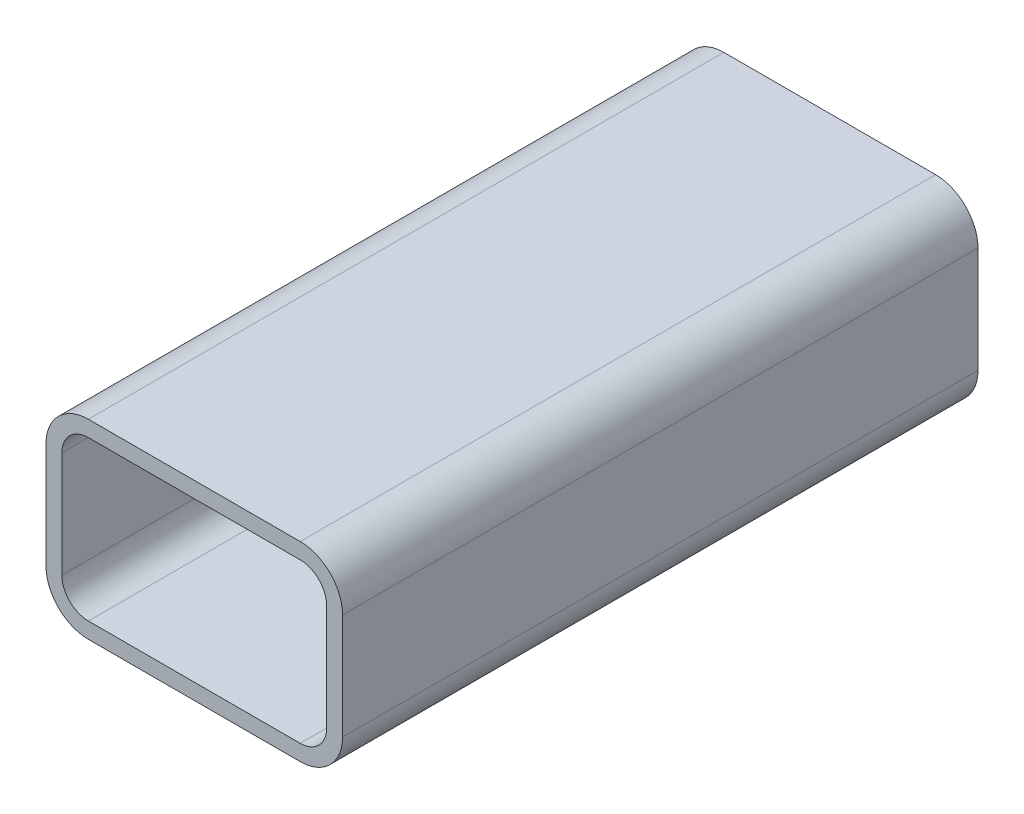
ISO-10303-21;
HEADER;
FILE_DESCRIPTION(('STEP AP214'),'2;1');
FILE_NAME('part.step','',(''),(''),'','','');
FILE_SCHEMA(('AUTOMOTIVE_DESIGN { 1 0 10303 214 1 1 1 1 }'));
ENDSEC;
DATA;
#1=APPLICATION_CONTEXT('core data for automotive mechanical design processes');
#2=APPLICATION_PROTOCOL_DEFINITION('international standard','automotive_design',2000,#1);
#3=PRODUCT_CONTEXT('',#1,'mechanical');
#4=PRODUCT('Part','Part','',(#3));
#5=PRODUCT_RELATED_PRODUCT_CATEGORY('part','',(#4));
#6=PRODUCT_DEFINITION_FORMATION('','',#4);
#7=PRODUCT_DEFINITION_CONTEXT('part definition',#1,'design');
#8=PRODUCT_DEFINITION('design','',#6,#7);
#9=PRODUCT_DEFINITION_SHAPE('','',#8);
#10=(LENGTH_UNIT() NAMED_UNIT(*) SI_UNIT(.MILLI.,.METRE.));
#11=(NAMED_UNIT(*) PLANE_ANGLE_UNIT() SI_UNIT($,.RADIAN.));
#12=(NAMED_UNIT(*) SI_UNIT($,.STERADIAN.) SOLID_ANGLE_UNIT());
#13=UNCERTAINTY_MEASURE_WITH_UNIT(LENGTH_MEASURE(1.E-05),#10,'distance_accuracy_value','');
#14=(GEOMETRIC_REPRESENTATION_CONTEXT(3) GLOBAL_UNCERTAINTY_ASSIGNED_CONTEXT((#13)) GLOBAL_UNIT_ASSIGNED_CONTEXT((#10,
#11,#12)) REPRESENTATION_CONTEXT('',''));
#15=CARTESIAN_POINT('',(0.,0.,0.));
#16=DIRECTION('',(0.,0.,1.));
#17=DIRECTION('',(1.,0.,0.));
#18=AXIS2_PLACEMENT_3D('',#15,#16,#17);
#19=CARTESIAN_POINT('',(-20.,10.,60.));
#20=DIRECTION('',(0.,0.,1.));
#21=DIRECTION('',(1.,0.,0.));
#22=AXIS2_PLACEMENT_3D('',#19,#20,#21);
#23=PLANE('',#22);
#24=CARTESIAN_POINT('',(-20.,10.,60.));
#25=DIRECTION('',(0.,0.,1.));
#26=DIRECTION('',(1.,0.,0.));
#27=AXIS2_PLACEMENT_3D('',#24,#25,#26);
#28=CIRCLE('',#27,8.);
#29=CARTESIAN_POINT('',(-19.9999999999999,18.,60.));
#30=VERTEX_POINT('',#29);
#31=CARTESIAN_POINT('',(-28.,9.99999999999996,60.));
#32=VERTEX_POINT('',#31);
#33=EDGE_CURVE('E264',#30,#32,#28,.T.);
#34=ORIENTED_EDGE('',*,*,#33,.T.);
#35=DIRECTION('',(0.,-1.,0.));
#36=VECTOR('',#35,1.);
#37=CARTESIAN_POINT('',(-28.,9.99999999999996,60.));
#38=LINE('',#37,#36);
#39=CARTESIAN_POINT('',(-28.,-9.99999999999996,60.));
#40=VERTEX_POINT('',#39);
#41=EDGE_CURVE('E267',#32,#40,#38,.T.);
#42=ORIENTED_EDGE('',*,*,#41,.T.);
#43=CARTESIAN_POINT('',(-20.,-10.,60.));
#44=DIRECTION('',(0.,0.,1.));
#45=DIRECTION('',(1.,0.,0.));
#46=AXIS2_PLACEMENT_3D('',#43,#44,#45);
#47=CIRCLE('',#46,8.);
#48=CARTESIAN_POINT('',(-19.9999999999999,-18.,60.));
#49=VERTEX_POINT('',#48);
#50=EDGE_CURVE('E270',#40,#49,#47,.T.);
#51=ORIENTED_EDGE('',*,*,#50,.T.);
#52=DIRECTION('',(1.,0.,0.));
#53=VECTOR('',#52,1.);
#54=CARTESIAN_POINT('',(-20.,-18.,60.));
#55=LINE('',#54,#53);
#56=CARTESIAN_POINT('',(20.,-18.,60.));
#57=VERTEX_POINT('',#56);
#58=EDGE_CURVE('E272',#49,#57,#55,.T.);
#59=ORIENTED_EDGE('',*,*,#58,.T.);
#60=CARTESIAN_POINT('',(20.,-10.,60.));
#61=DIRECTION('',(0.,0.,1.));
#62=DIRECTION('',(1.,0.,0.));
#63=AXIS2_PLACEMENT_3D('',#60,#61,#62);
#64=CIRCLE('',#63,8.);
#65=CARTESIAN_POINT('',(28.,-9.99999999999996,60.));
#66=VERTEX_POINT('',#65);
#67=EDGE_CURVE('E274',#57,#66,#64,.T.);
#68=ORIENTED_EDGE('',*,*,#67,.T.);
#69=DIRECTION('',(0.,-1.,0.));
#70=VECTOR('',#69,1.);
#71=CARTESIAN_POINT('',(28.,9.99999999999997,60.));
#72=LINE('',#71,#70);
#73=CARTESIAN_POINT('',(28.,9.99999999999995,60.));
#74=VERTEX_POINT('',#73);
#75=EDGE_CURVE('E276',#74,#66,#72,.T.);
#76=ORIENTED_EDGE('',*,*,#75,.F.);
#77=CARTESIAN_POINT('',(20.,10.,60.));
#78=DIRECTION('',(0.,0.,1.));
#79=DIRECTION('',(1.,0.,0.));
#80=AXIS2_PLACEMENT_3D('',#77,#78,#79);
#81=CIRCLE('',#80,8.);
#82=CARTESIAN_POINT('',(20.,18.,60.));
#83=VERTEX_POINT('',#82);
#84=EDGE_CURVE('E279',#83,#74,#81,.F.);
#85=ORIENTED_EDGE('',*,*,#84,.F.);
#86=DIRECTION('',(1.,0.,0.));
#87=VECTOR('',#86,1.);
#88=CARTESIAN_POINT('',(-20.,18.,60.));
#89=LINE('',#88,#87);
#90=EDGE_CURVE('E282',#30,#83,#89,.T.);
#91=ORIENTED_EDGE('',*,*,#90,.F.);
#92=EDGE_LOOP('',(#34,#42,#51,#59,#68,#76,#85,#91));
#93=FACE_BOUND('',#92,.T.);
#94=DIRECTION('',(0.,-1.,0.));
#95=VECTOR('',#94,1.);
#96=CARTESIAN_POINT('',(-25.,9.99999999999996,60.));
#97=LINE('',#96,#95);
#98=CARTESIAN_POINT('',(-25.,9.99999999999996,60.));
#99=VERTEX_POINT('',#98);
#100=CARTESIAN_POINT('',(-25.,-9.99999999999996,60.));
#101=VERTEX_POINT('',#100);
#102=EDGE_CURVE('E206',#99,#101,#97,.T.);
#103=ORIENTED_EDGE('',*,*,#102,.F.);
#104=CARTESIAN_POINT('',(-20.,10.,60.));
#105=DIRECTION('',(0.,0.,1.));
#106=DIRECTION('',(1.,0.,0.));
#107=AXIS2_PLACEMENT_3D('',#104,#105,#106);
#108=CIRCLE('',#107,5.);
#109=CARTESIAN_POINT('',(-20.,15.,60.));
#110=VERTEX_POINT('',#109);
#111=EDGE_CURVE('E197',#110,#99,#108,.T.);
#112=ORIENTED_EDGE('',*,*,#111,.F.);
#113=DIRECTION('',(1.,0.,0.));
#114=VECTOR('',#113,1.);
#115=CARTESIAN_POINT('',(-20.,15.,60.));
#116=LINE('',#115,#114);
#117=CARTESIAN_POINT('',(20.,15.,60.));
#118=VERTEX_POINT('',#117);
#119=EDGE_CURVE('E231',#110,#118,#116,.T.);
#120=ORIENTED_EDGE('',*,*,#119,.T.);
#121=CARTESIAN_POINT('',(20.,10.,60.));
#122=DIRECTION('',(0.,0.,-1.));
#123=DIRECTION('',(-1.,0.,0.));
#124=AXIS2_PLACEMENT_3D('',#121,#122,#123);
#125=CIRCLE('',#124,5.);
#126=CARTESIAN_POINT('',(25.,9.99999999999997,60.));
#127=VERTEX_POINT('',#126);
#128=EDGE_CURVE('E100',#118,#127,#125,.T.);
#129=ORIENTED_EDGE('',*,*,#128,.T.);
#130=DIRECTION('',(0.,-1.,0.));
#131=VECTOR('',#130,1.);
#132=CARTESIAN_POINT('',(25.,9.99999999999997,60.));
#133=LINE('',#132,#131);
#134=CARTESIAN_POINT('',(25.,-9.99999999999996,60.));
#135=VERTEX_POINT('',#134);
#136=EDGE_CURVE('E227',#127,#135,#133,.T.);
#137=ORIENTED_EDGE('',*,*,#136,.T.);
#138=CARTESIAN_POINT('',(20.,-10.,60.));
#139=DIRECTION('',(0.,0.,1.));
#140=DIRECTION('',(1.,0.,0.));
#141=AXIS2_PLACEMENT_3D('',#138,#139,#140);
#142=CIRCLE('',#141,5.);
#143=CARTESIAN_POINT('',(20.,-15.,60.));
#144=VERTEX_POINT('',#143);
#145=EDGE_CURVE('E225',#144,#135,#142,.T.);
#146=ORIENTED_EDGE('',*,*,#145,.F.);
#147=DIRECTION('',(1.,0.,0.));
#148=VECTOR('',#147,1.);
#149=CARTESIAN_POINT('',(-20.,-15.,60.));
#150=LINE('',#149,#148);
#151=CARTESIAN_POINT('',(-20.,-15.,60.));
#152=VERTEX_POINT('',#151);
#153=EDGE_CURVE('E221',#152,#144,#150,.T.);
#154=ORIENTED_EDGE('',*,*,#153,.F.);
#155=CARTESIAN_POINT('',(-20.,-10.,60.));
#156=DIRECTION('',(0.,0.,1.));
#157=DIRECTION('',(1.,0.,0.));
#158=AXIS2_PLACEMENT_3D('',#155,#156,#157);
#159=CIRCLE('',#158,5.);
#160=EDGE_CURVE('E219',#101,#152,#159,.T.);
#161=ORIENTED_EDGE('',*,*,#160,.F.);
#162=EDGE_LOOP('',(#103,#112,#120,#129,#137,#146,#154,#161));
#163=FACE_BOUND('',#162,.T.);
#164=ADVANCED_FACE('F85',(#93,#163),#23,.T.);
#165=CARTESIAN_POINT('',(-20.,10.,-60.));
#166=DIRECTION('',(0.,0.,1.));
#167=DIRECTION('',(1.,0.,0.));
#168=AXIS2_PLACEMENT_3D('',#165,#166,#167);
#169=PLANE('',#168);
#170=CARTESIAN_POINT('',(-20.,10.,-60.));
#171=DIRECTION('',(0.,0.,1.));
#172=DIRECTION('',(1.,0.,0.));
#173=AXIS2_PLACEMENT_3D('',#170,#171,#172);
#174=CIRCLE('',#173,8.);
#175=CARTESIAN_POINT('',(-19.9999999999999,18.,-60.));
#176=VERTEX_POINT('',#175);
#177=CARTESIAN_POINT('',(-28.,9.99999999999996,-60.));
#178=VERTEX_POINT('',#177);
#179=EDGE_CURVE('E214',#176,#178,#174,.T.);
#180=ORIENTED_EDGE('',*,*,#179,.F.);
#181=DIRECTION('',(1.,0.,0.));
#182=VECTOR('',#181,1.);
#183=CARTESIAN_POINT('',(-20.,18.,-60.));
#184=LINE('',#183,#182);
#185=CARTESIAN_POINT('',(20.,18.,-60.));
#186=VERTEX_POINT('',#185);
#187=EDGE_CURVE('E268',#176,#186,#184,.T.);
#188=ORIENTED_EDGE('',*,*,#187,.T.);
#189=CARTESIAN_POINT('',(20.,10.,-60.));
#190=DIRECTION('',(0.,0.,1.));
#191=DIRECTION('',(1.,0.,0.));
#192=AXIS2_PLACEMENT_3D('',#189,#190,#191);
#193=CIRCLE('',#192,8.);
#194=CARTESIAN_POINT('',(28.,9.99999999999995,-60.));
#195=VERTEX_POINT('',#194);
#196=EDGE_CURVE('E300',#186,#195,#193,.F.);
#197=ORIENTED_EDGE('',*,*,#196,.T.);
#198=DIRECTION('',(0.,-1.,0.));
#199=VECTOR('',#198,1.);
#200=CARTESIAN_POINT('',(28.,9.99999999999997,-60.));
#201=LINE('',#200,#199);
#202=CARTESIAN_POINT('',(28.,-9.99999999999996,-60.));
#203=VERTEX_POINT('',#202);
#204=EDGE_CURVE('E297',#195,#203,#201,.T.);
#205=ORIENTED_EDGE('',*,*,#204,.T.);
#206=CARTESIAN_POINT('',(20.,-10.,-60.));
#207=DIRECTION('',(0.,0.,1.));
#208=DIRECTION('',(1.,0.,0.));
#209=AXIS2_PLACEMENT_3D('',#206,#207,#208);
#210=CIRCLE('',#209,8.);
#211=CARTESIAN_POINT('',(20.,-18.,-60.));
#212=VERTEX_POINT('',#211);
#213=EDGE_CURVE('E294',#212,#203,#210,.T.);
#214=ORIENTED_EDGE('',*,*,#213,.F.);
#215=DIRECTION('',(1.,0.,0.));
#216=VECTOR('',#215,1.);
#217=CARTESIAN_POINT('',(-20.,-18.,-60.));
#218=LINE('',#217,#216);
#219=CARTESIAN_POINT('',(-19.9999999999999,-18.,-60.));
#220=VERTEX_POINT('',#219);
#221=EDGE_CURVE('E292',#220,#212,#218,.T.);
#222=ORIENTED_EDGE('',*,*,#221,.F.);
#223=CARTESIAN_POINT('',(-20.,-10.,-60.));
#224=DIRECTION('',(0.,0.,1.));
#225=DIRECTION('',(1.,0.,0.));
#226=AXIS2_PLACEMENT_3D('',#223,#224,#225);
#227=CIRCLE('',#226,8.);
#228=CARTESIAN_POINT('',(-28.,-9.99999999999996,-60.));
#229=VERTEX_POINT('',#228);
#230=EDGE_CURVE('E290',#229,#220,#227,.T.);
#231=ORIENTED_EDGE('',*,*,#230,.F.);
#232=DIRECTION('',(0.,-1.,0.));
#233=VECTOR('',#232,1.);
#234=CARTESIAN_POINT('',(-28.,9.99999999999996,-60.));
#235=LINE('',#234,#233);
#236=EDGE_CURVE('E288',#178,#229,#235,.T.);
#237=ORIENTED_EDGE('',*,*,#236,.F.);
#238=EDGE_LOOP('',(#180,#188,#197,#205,#214,#222,#231,#237));
#239=FACE_BOUND('',#238,.T.);
#240=CARTESIAN_POINT('',(-20.,10.,-60.));
#241=DIRECTION('',(0.,0.,1.));
#242=DIRECTION('',(1.,0.,0.));
#243=AXIS2_PLACEMENT_3D('',#240,#241,#242);
#244=CIRCLE('',#243,5.);
#245=CARTESIAN_POINT('',(-20.,15.,-60.));
#246=VERTEX_POINT('',#245);
#247=CARTESIAN_POINT('',(-25.,9.99999999999996,-60.));
#248=VERTEX_POINT('',#247);
#249=EDGE_CURVE('E108',#246,#248,#244,.T.);
#250=ORIENTED_EDGE('',*,*,#249,.T.);
#251=DIRECTION('',(0.,-1.,0.));
#252=VECTOR('',#251,1.);
#253=CARTESIAN_POINT('',(-25.,9.99999999999996,-60.));
#254=LINE('',#253,#252);
#255=CARTESIAN_POINT('',(-25.,-9.99999999999996,-60.));
#256=VERTEX_POINT('',#255);
#257=EDGE_CURVE('E213',#248,#256,#254,.T.);
#258=ORIENTED_EDGE('',*,*,#257,.T.);
#259=CARTESIAN_POINT('',(-20.,-10.,-60.));
#260=DIRECTION('',(0.,0.,1.));
#261=DIRECTION('',(1.,0.,0.));
#262=AXIS2_PLACEMENT_3D('',#259,#260,#261);
#263=CIRCLE('',#262,5.);
#264=CARTESIAN_POINT('',(-20.,-15.,-60.));
#265=VERTEX_POINT('',#264);
#266=EDGE_CURVE('E235',#256,#265,#263,.T.);
#267=ORIENTED_EDGE('',*,*,#266,.T.);
#268=DIRECTION('',(1.,0.,0.));
#269=VECTOR('',#268,1.);
#270=CARTESIAN_POINT('',(-20.,-15.,-60.));
#271=LINE('',#270,#269);
#272=CARTESIAN_POINT('',(20.,-15.,-60.));
#273=VERTEX_POINT('',#272);
#274=EDGE_CURVE('E238',#265,#273,#271,.T.);
#275=ORIENTED_EDGE('',*,*,#274,.T.);
#276=CARTESIAN_POINT('',(20.,-10.,-60.));
#277=DIRECTION('',(0.,0.,1.));
#278=DIRECTION('',(1.,0.,0.));
#279=AXIS2_PLACEMENT_3D('',#276,#277,#278);
#280=CIRCLE('',#279,5.);
#281=CARTESIAN_POINT('',(25.,-9.99999999999996,-60.));
#282=VERTEX_POINT('',#281);
#283=EDGE_CURVE('E241',#273,#282,#280,.T.);
#284=ORIENTED_EDGE('',*,*,#283,.T.);
#285=DIRECTION('',(0.,-1.,0.));
#286=VECTOR('',#285,1.);
#287=CARTESIAN_POINT('',(25.,9.99999999999997,-60.));
#288=LINE('',#287,#286);
#289=CARTESIAN_POINT('',(25.,9.99999999999997,-60.));
#290=VERTEX_POINT('',#289);
#291=EDGE_CURVE('E244',#290,#282,#288,.T.);
#292=ORIENTED_EDGE('',*,*,#291,.F.);
#293=CARTESIAN_POINT('',(20.,10.,-60.));
#294=DIRECTION('',(0.,0.,-1.));
#295=DIRECTION('',(-1.,0.,0.));
#296=AXIS2_PLACEMENT_3D('',#293,#294,#295);
#297=CIRCLE('',#296,5.);
#298=CARTESIAN_POINT('',(20.,15.,-60.));
#299=VERTEX_POINT('',#298);
#300=EDGE_CURVE('E247',#299,#290,#297,.T.);
#301=ORIENTED_EDGE('',*,*,#300,.F.);
#302=DIRECTION('',(1.,0.,0.));
#303=VECTOR('',#302,1.);
#304=CARTESIAN_POINT('',(-20.,15.,-60.));
#305=LINE('',#304,#303);
#306=EDGE_CURVE('E207',#246,#299,#305,.T.);
#307=ORIENTED_EDGE('',*,*,#306,.F.);
#308=EDGE_LOOP('',(#250,#258,#267,#275,#284,#292,#301,#307));
#309=FACE_BOUND('',#308,.T.);
#310=ADVANCED_FACE('F328',(#239,#309),#169,.F.);
#311=CARTESIAN_POINT('',(-20.,10.,60.));
#312=DIRECTION('',(0.,0.,-1.));
#313=DIRECTION('',(-1.,0.,0.));
#314=AXIS2_PLACEMENT_3D('',#311,#312,#313);
#315=CYLINDRICAL_SURFACE('',#314,8.);
#316=ORIENTED_EDGE('',*,*,#179,.T.);
#317=DIRECTION('',(0.,0.,-1.));
#318=VECTOR('',#317,1.);
#319=CARTESIAN_POINT('',(-28.,9.99999999999996,60.));
#320=LINE('',#319,#318);
#321=EDGE_CURVE('E12',#32,#178,#320,.T.);
#322=ORIENTED_EDGE('',*,*,#321,.F.);
#323=ORIENTED_EDGE('',*,*,#33,.F.);
#324=DIRECTION('',(0.,0.,-1.));
#325=VECTOR('',#324,1.);
#326=CARTESIAN_POINT('',(-19.9999999999999,18.,60.));
#327=LINE('',#326,#325);
#328=EDGE_CURVE('E285',#30,#176,#327,.T.);
#329=ORIENTED_EDGE('',*,*,#328,.T.);
#330=EDGE_LOOP('',(#316,#322,#323,#329));
#331=FACE_BOUND('',#330,.T.);
#332=ADVANCED_FACE('F87',(#331),#315,.T.);
#333=CARTESIAN_POINT('',(-28.,9.99999999999996,60.));
#334=DIRECTION('',(1.,0.,0.));
#335=DIRECTION('',(0.,1.,0.));
#336=AXIS2_PLACEMENT_3D('',#333,#334,#335);
#337=PLANE('',#336);
#338=ORIENTED_EDGE('',*,*,#236,.T.);
#339=DIRECTION('',(0.,0.,-1.));
#340=VECTOR('',#339,1.);
#341=CARTESIAN_POINT('',(-28.,-9.99999999999996,60.));
#342=LINE('',#341,#340);
#343=EDGE_CURVE('E93',#40,#229,#342,.T.);
#344=ORIENTED_EDGE('',*,*,#343,.F.);
#345=ORIENTED_EDGE('',*,*,#41,.F.);
#346=ORIENTED_EDGE('',*,*,#321,.T.);
#347=EDGE_LOOP('',(#338,#344,#345,#346));
#348=FACE_BOUND('',#347,.T.);
#349=ADVANCED_FACE('F345',(#348),#337,.F.);
#350=CARTESIAN_POINT('',(-20.,-10.,60.));
#351=DIRECTION('',(0.,0.,-1.));
#352=DIRECTION('',(-1.,0.,0.));
#353=AXIS2_PLACEMENT_3D('',#350,#351,#352);
#354=CYLINDRICAL_SURFACE('',#353,8.);
#355=ORIENTED_EDGE('',*,*,#230,.T.);
#356=DIRECTION('',(0.,0.,-1.));
#357=VECTOR('',#356,1.);
#358=CARTESIAN_POINT('',(-19.9999999999999,-18.,60.));
#359=LINE('',#358,#357);
#360=EDGE_CURVE('E315',#49,#220,#359,.T.);
#361=ORIENTED_EDGE('',*,*,#360,.F.);
#362=ORIENTED_EDGE('',*,*,#50,.F.);
#363=ORIENTED_EDGE('',*,*,#343,.T.);
#364=EDGE_LOOP('',(#355,#361,#362,#363));
#365=FACE_BOUND('',#364,.T.);
#366=ADVANCED_FACE('F322',(#365),#354,.T.);
#367=CARTESIAN_POINT('',(-20.,-18.,60.));
#368=DIRECTION('',(0.,1.,0.));
#369=DIRECTION('',(0.,0.,1.));
#370=AXIS2_PLACEMENT_3D('',#367,#368,#369);
#371=PLANE('',#370);
#372=ORIENTED_EDGE('',*,*,#221,.T.);
#373=DIRECTION('',(0.,0.,-1.));
#374=VECTOR('',#373,1.);
#375=CARTESIAN_POINT('',(20.,-18.,60.));
#376=LINE('',#375,#374);
#377=EDGE_CURVE('E312',#57,#212,#376,.T.);
#378=ORIENTED_EDGE('',*,*,#377,.F.);
#379=ORIENTED_EDGE('',*,*,#58,.F.);
#380=ORIENTED_EDGE('',*,*,#360,.T.);
#381=EDGE_LOOP('',(#372,#378,#379,#380));
#382=FACE_BOUND('',#381,.T.);
#383=ADVANCED_FACE('F333',(#382),#371,.F.);
#384=CARTESIAN_POINT('',(20.,-10.,60.));
#385=DIRECTION('',(0.,0.,-1.));
#386=DIRECTION('',(-1.,0.,0.));
#387=AXIS2_PLACEMENT_3D('',#384,#385,#386);
#388=CYLINDRICAL_SURFACE('',#387,8.);
#389=ORIENTED_EDGE('',*,*,#213,.T.);
#390=DIRECTION('',(0.,0.,-1.));
#391=VECTOR('',#390,1.);
#392=CARTESIAN_POINT('',(28.,-9.99999999999996,60.));
#393=LINE('',#392,#391);
#394=EDGE_CURVE('E310',#66,#203,#393,.T.);
#395=ORIENTED_EDGE('',*,*,#394,.F.);
#396=ORIENTED_EDGE('',*,*,#67,.F.);
#397=ORIENTED_EDGE('',*,*,#377,.T.);
#398=EDGE_LOOP('',(#389,#395,#396,#397));
#399=FACE_BOUND('',#398,.T.);
#400=ADVANCED_FACE('F337',(#399),#388,.T.);
#401=CARTESIAN_POINT('',(28.,9.99999999999997,60.));
#402=DIRECTION('',(1.,0.,0.));
#403=DIRECTION('',(0.,1.,0.));
#404=AXIS2_PLACEMENT_3D('',#401,#402,#403);
#405=PLANE('',#404);
#406=ORIENTED_EDGE('',*,*,#204,.F.);
#407=DIRECTION('',(0.,0.,-1.));
#408=VECTOR('',#407,1.);
#409=CARTESIAN_POINT('',(28.,9.99999999999995,60.));
#410=LINE('',#409,#408);
#411=EDGE_CURVE('E308',#74,#195,#410,.T.);
#412=ORIENTED_EDGE('',*,*,#411,.F.);
#413=ORIENTED_EDGE('',*,*,#75,.T.);
#414=ORIENTED_EDGE('',*,*,#394,.T.);
#415=EDGE_LOOP('',(#406,#412,#413,#414));
#416=FACE_BOUND('',#415,.T.);
#417=ADVANCED_FACE('F355',(#416),#405,.T.);
#418=CARTESIAN_POINT('',(20.,10.,60.));
#419=DIRECTION('',(0.,0.,-1.));
#420=DIRECTION('',(-1.,0.,0.));
#421=AXIS2_PLACEMENT_3D('',#418,#419,#420);
#422=CYLINDRICAL_SURFACE('',#421,8.);
#423=ORIENTED_EDGE('',*,*,#196,.F.);
#424=DIRECTION('',(0.,0.,-1.));
#425=VECTOR('',#424,1.);
#426=CARTESIAN_POINT('',(20.,18.,60.));
#427=LINE('',#426,#425);
#428=EDGE_CURVE('E306',#83,#186,#427,.T.);
#429=ORIENTED_EDGE('',*,*,#428,.F.);
#430=ORIENTED_EDGE('',*,*,#84,.T.);
#431=ORIENTED_EDGE('',*,*,#411,.T.);
#432=EDGE_LOOP('',(#423,#429,#430,#431));
#433=FACE_BOUND('',#432,.T.);
#434=ADVANCED_FACE('F352',(#433),#422,.T.);
#435=CARTESIAN_POINT('',(-20.,18.,60.));
#436=DIRECTION('',(0.,1.,0.));
#437=DIRECTION('',(0.,0.,1.));
#438=AXIS2_PLACEMENT_3D('',#435,#436,#437);
#439=PLANE('',#438);
#440=ORIENTED_EDGE('',*,*,#187,.F.);
#441=ORIENTED_EDGE('',*,*,#328,.F.);
#442=ORIENTED_EDGE('',*,*,#90,.T.);
#443=ORIENTED_EDGE('',*,*,#428,.T.);
#444=EDGE_LOOP('',(#440,#441,#442,#443));
#445=FACE_BOUND('',#444,.T.);
#446=ADVANCED_FACE('F349',(#445),#439,.T.);
#447=CARTESIAN_POINT('',(-20.,10.,60.));
#448=DIRECTION('',(0.,0.,-1.));
#449=DIRECTION('',(-1.,0.,0.));
#450=AXIS2_PLACEMENT_3D('',#447,#448,#449);
#451=CYLINDRICAL_SURFACE('',#450,5.);
#452=ORIENTED_EDGE('',*,*,#249,.F.);
#453=DIRECTION('',(0.,0.,-1.));
#454=VECTOR('',#453,1.);
#455=CARTESIAN_POINT('',(-20.,15.,60.));
#456=LINE('',#455,#454);
#457=EDGE_CURVE('E201',#110,#246,#456,.T.);
#458=ORIENTED_EDGE('',*,*,#457,.F.);
#459=ORIENTED_EDGE('',*,*,#111,.T.);
#460=DIRECTION('',(0.,0.,-1.));
#461=VECTOR('',#460,1.);
#462=CARTESIAN_POINT('',(-25.,9.99999999999996,60.));
#463=LINE('',#462,#461);
#464=EDGE_CURVE('E200',#99,#248,#463,.T.);
#465=ORIENTED_EDGE('',*,*,#464,.T.);
#466=EDGE_LOOP('',(#452,#458,#459,#465));
#467=FACE_BOUND('',#466,.T.);
#468=ADVANCED_FACE('F199',(#467),#451,.F.);
#469=CARTESIAN_POINT('',(-25.,9.99999999999996,60.));
#470=DIRECTION('',(1.,0.,0.));
#471=DIRECTION('',(0.,1.,0.));
#472=AXIS2_PLACEMENT_3D('',#469,#470,#471);
#473=PLANE('',#472);
#474=ORIENTED_EDGE('',*,*,#257,.F.);
#475=ORIENTED_EDGE('',*,*,#464,.F.);
#476=ORIENTED_EDGE('',*,*,#102,.T.);
#477=DIRECTION('',(0.,0.,-1.));
#478=VECTOR('',#477,1.);
#479=CARTESIAN_POINT('',(-25.,-9.99999999999996,60.));
#480=LINE('',#479,#478);
#481=EDGE_CURVE('E215',#101,#256,#480,.T.);
#482=ORIENTED_EDGE('',*,*,#481,.T.);
#483=EDGE_LOOP('',(#474,#475,#476,#482));
#484=FACE_BOUND('',#483,.T.);
#485=ADVANCED_FACE('F210',(#484),#473,.T.);
#486=CARTESIAN_POINT('',(-20.,-10.,60.));
#487=DIRECTION('',(0.,0.,-1.));
#488=DIRECTION('',(-1.,0.,0.));
#489=AXIS2_PLACEMENT_3D('',#486,#487,#488);
#490=CYLINDRICAL_SURFACE('',#489,5.);
#491=ORIENTED_EDGE('',*,*,#266,.F.);
#492=ORIENTED_EDGE('',*,*,#481,.F.);
#493=ORIENTED_EDGE('',*,*,#160,.T.);
#494=DIRECTION('',(0.,0.,-1.));
#495=VECTOR('',#494,1.);
#496=CARTESIAN_POINT('',(-20.,-15.,60.));
#497=LINE('',#496,#495);
#498=EDGE_CURVE('E261',#152,#265,#497,.T.);
#499=ORIENTED_EDGE('',*,*,#498,.T.);
#500=EDGE_LOOP('',(#491,#492,#493,#499));
#501=FACE_BOUND('',#500,.T.);
#502=ADVANCED_FACE('F380',(#501),#490,.F.);
#503=CARTESIAN_POINT('',(-20.,-15.,60.));
#504=DIRECTION('',(0.,1.,0.));
#505=DIRECTION('',(0.,0.,1.));
#506=AXIS2_PLACEMENT_3D('',#503,#504,#505);
#507=PLANE('',#506);
#508=ORIENTED_EDGE('',*,*,#274,.F.);
#509=ORIENTED_EDGE('',*,*,#498,.F.);
#510=ORIENTED_EDGE('',*,*,#153,.T.);
#511=DIRECTION('',(0.,0.,-1.));
#512=VECTOR('',#511,1.);
#513=CARTESIAN_POINT('',(20.,-15.,60.));
#514=LINE('',#513,#512);
#515=EDGE_CURVE('E259',#144,#273,#514,.T.);
#516=ORIENTED_EDGE('',*,*,#515,.T.);
#517=EDGE_LOOP('',(#508,#509,#510,#516));
#518=FACE_BOUND('',#517,.T.);
#519=ADVANCED_FACE('F384',(#518),#507,.T.);
#520=CARTESIAN_POINT('',(20.,-10.,60.));
#521=DIRECTION('',(0.,0.,-1.));
#522=DIRECTION('',(-1.,0.,0.));
#523=AXIS2_PLACEMENT_3D('',#520,#521,#522);
#524=CYLINDRICAL_SURFACE('',#523,5.);
#525=ORIENTED_EDGE('',*,*,#283,.F.);
#526=ORIENTED_EDGE('',*,*,#515,.F.);
#527=ORIENTED_EDGE('',*,*,#145,.T.);
#528=DIRECTION('',(0.,0.,-1.));
#529=VECTOR('',#528,1.);
#530=CARTESIAN_POINT('',(25.,-9.99999999999996,60.));
#531=LINE('',#530,#529);
#532=EDGE_CURVE('E257',#135,#282,#531,.T.);
#533=ORIENTED_EDGE('',*,*,#532,.T.);
#534=EDGE_LOOP('',(#525,#526,#527,#533));
#535=FACE_BOUND('',#534,.T.);
#536=ADVANCED_FACE('F390',(#535),#524,.F.);
#537=CARTESIAN_POINT('',(25.,9.99999999999997,60.));
#538=DIRECTION('',(1.,0.,0.));
#539=DIRECTION('',(0.,1.,0.));
#540=AXIS2_PLACEMENT_3D('',#537,#538,#539);
#541=PLANE('',#540);
#542=ORIENTED_EDGE('',*,*,#291,.T.);
#543=ORIENTED_EDGE('',*,*,#532,.F.);
#544=ORIENTED_EDGE('',*,*,#136,.F.);
#545=DIRECTION('',(0.,0.,-1.));
#546=VECTOR('',#545,1.);
#547=CARTESIAN_POINT('',(25.,9.99999999999997,60.));
#548=LINE('',#547,#546);
#549=EDGE_CURVE('E255',#127,#290,#548,.T.);
#550=ORIENTED_EDGE('',*,*,#549,.T.);
#551=EDGE_LOOP('',(#542,#543,#544,#550));
#552=FACE_BOUND('',#551,.T.);
#553=ADVANCED_FACE('F394',(#552),#541,.F.);
#554=CARTESIAN_POINT('',(20.,10.,60.));
#555=DIRECTION('',(0.,0.,-1.));
#556=DIRECTION('',(-1.,0.,0.));
#557=AXIS2_PLACEMENT_3D('',#554,#555,#556);
#558=CYLINDRICAL_SURFACE('',#557,5.);
#559=ORIENTED_EDGE('',*,*,#300,.T.);
#560=ORIENTED_EDGE('',*,*,#549,.F.);
#561=ORIENTED_EDGE('',*,*,#128,.F.);
#562=DIRECTION('',(0.,0.,-1.));
#563=VECTOR('',#562,1.);
#564=CARTESIAN_POINT('',(20.,15.,60.));
#565=LINE('',#564,#563);
#566=EDGE_CURVE('E253',#118,#299,#565,.T.);
#567=ORIENTED_EDGE('',*,*,#566,.T.);
#568=EDGE_LOOP('',(#559,#560,#561,#567));
#569=FACE_BOUND('',#568,.T.);
#570=ADVANCED_FACE('F398',(#569),#558,.F.);
#571=CARTESIAN_POINT('',(-20.,15.,60.));
#572=DIRECTION('',(0.,1.,0.));
#573=DIRECTION('',(0.,0.,1.));
#574=AXIS2_PLACEMENT_3D('',#571,#572,#573);
#575=PLANE('',#574);
#576=ORIENTED_EDGE('',*,*,#306,.T.);
#577=ORIENTED_EDGE('',*,*,#566,.F.);
#578=ORIENTED_EDGE('',*,*,#119,.F.);
#579=ORIENTED_EDGE('',*,*,#457,.T.);
#580=EDGE_LOOP('',(#576,#577,#578,#579));
#581=FACE_BOUND('',#580,.T.);
#582=ADVANCED_FACE('F402',(#581),#575,.F.);
#583=CLOSED_SHELL('',(#164,#310,#332,#349,#366,#383,#400,#417,#434,#446,#468,#485,#502,#519,
#536,#553,#570,#582));
#584=MANIFOLD_SOLID_BREP('B2',#583);
#585=ADVANCED_BREP_SHAPE_REPRESENTATION('',(#18,#584),#14);
#586=SHAPE_DEFINITION_REPRESENTATION(#9,#585);
ENDSEC;
END-ISO-10303-21;
